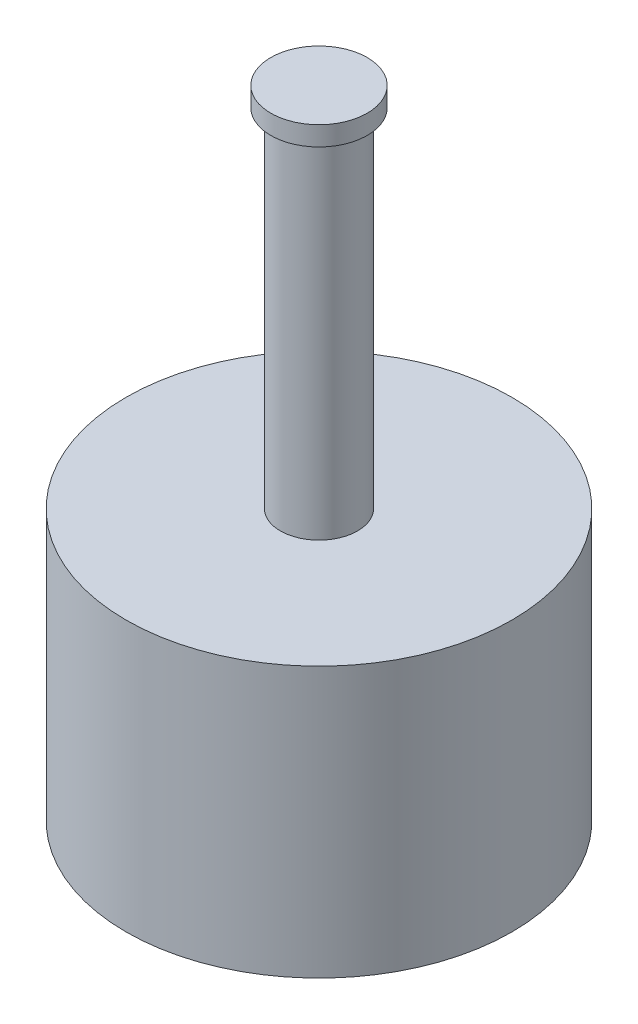
ISO-10303-21;
HEADER;
FILE_DESCRIPTION(('STEP AP214'),'2;1');
FILE_NAME('part.step','',(''),(''),'','','');
FILE_SCHEMA(('AUTOMOTIVE_DESIGN { 1 0 10303 214 1 1 1 1 }'));
ENDSEC;
DATA;
#1=APPLICATION_CONTEXT('core data for automotive mechanical design processes');
#2=APPLICATION_PROTOCOL_DEFINITION('international standard','automotive_design',2000,#1);
#3=PRODUCT_CONTEXT('',#1,'mechanical');
#4=PRODUCT('Part','Part','',(#3));
#5=PRODUCT_RELATED_PRODUCT_CATEGORY('part','',(#4));
#6=PRODUCT_DEFINITION_FORMATION('','',#4);
#7=PRODUCT_DEFINITION_CONTEXT('part definition',#1,'design');
#8=PRODUCT_DEFINITION('design','',#6,#7);
#9=PRODUCT_DEFINITION_SHAPE('','',#8);
#10=(LENGTH_UNIT() NAMED_UNIT(*) SI_UNIT(.MILLI.,.METRE.));
#11=(NAMED_UNIT(*) PLANE_ANGLE_UNIT() SI_UNIT($,.RADIAN.));
#12=(NAMED_UNIT(*) SI_UNIT($,.STERADIAN.) SOLID_ANGLE_UNIT());
#13=UNCERTAINTY_MEASURE_WITH_UNIT(LENGTH_MEASURE(1.E-05),#10,'distance_accuracy_value','');
#14=(GEOMETRIC_REPRESENTATION_CONTEXT(3) GLOBAL_UNCERTAINTY_ASSIGNED_CONTEXT((#13)) GLOBAL_UNIT_ASSIGNED_CONTEXT((#10,
#11,#12)) REPRESENTATION_CONTEXT('',''));
#15=CARTESIAN_POINT('',(0.,0.,0.));
#16=DIRECTION('',(0.,0.,1.));
#17=DIRECTION('',(1.,0.,0.));
#18=AXIS2_PLACEMENT_3D('',#15,#16,#17);
#19=CARTESIAN_POINT('',(0.,12.,0.));
#20=DIRECTION('',(0.,1.,0.));
#21=DIRECTION('',(0.,0.,1.));
#22=AXIS2_PLACEMENT_3D('',#19,#20,#21);
#23=PLANE('',#22);
#24=CARTESIAN_POINT('',(0.,12.,0.));
#25=DIRECTION('',(0.,-1.,0.));
#26=DIRECTION('',(0.,0.,-1.));
#27=AXIS2_PLACEMENT_3D('',#24,#25,#26);
#28=CIRCLE('',#27,2.5);
#29=CARTESIAN_POINT('',(0.,12.,-2.5));
#30=VERTEX_POINT('',#29);
#31=EDGE_CURVE('E10',#30,#30,#28,.T.);
#32=ORIENTED_EDGE('',*,*,#31,.F.);
#33=EDGE_LOOP('',(#32));
#34=FACE_BOUND('',#33,.T.);
#35=ADVANCED_FACE('F43',(#34),#23,.T.);
#36=CARTESIAN_POINT('',(0.,0.,0.));
#37=DIRECTION('',(0.,-1.,0.));
#38=DIRECTION('',(0.,0.,-1.));
#39=AXIS2_PLACEMENT_3D('',#36,#37,#38);
#40=CYLINDRICAL_SURFACE('',#39,2.5);
#41=ORIENTED_EDGE('',*,*,#31,.T.);
#42=EDGE_LOOP('',(#41));
#43=FACE_BOUND('',#42,.T.);
#44=CARTESIAN_POINT('',(0.,11.,0.));
#45=DIRECTION('',(0.,-1.,0.));
#46=DIRECTION('',(0.,0.,-1.));
#47=AXIS2_PLACEMENT_3D('',#44,#45,#46);
#48=CIRCLE('',#47,2.5);
#49=CARTESIAN_POINT('',(0.,11.,-2.5));
#50=VERTEX_POINT('',#49);
#51=EDGE_CURVE('E47',#50,#50,#48,.T.);
#52=ORIENTED_EDGE('',*,*,#51,.F.);
#53=EDGE_LOOP('',(#52));
#54=FACE_BOUND('',#53,.T.);
#55=ADVANCED_FACE('F120',(#43,#54),#40,.T.);
#56=CARTESIAN_POINT('',(2.5,11.,0.));
#57=DIRECTION('',(0.,-1.,0.));
#58=DIRECTION('',(0.,0.,-1.));
#59=AXIS2_PLACEMENT_3D('',#56,#57,#58);
#60=PLANE('',#59);
#61=ORIENTED_EDGE('',*,*,#51,.T.);
#62=EDGE_LOOP('',(#61));
#63=FACE_BOUND('',#62,.T.);
#64=CARTESIAN_POINT('',(0.,11.,0.));
#65=DIRECTION('',(0.,-1.,0.));
#66=DIRECTION('',(0.,0.,-1.));
#67=AXIS2_PLACEMENT_3D('',#64,#65,#66);
#68=CIRCLE('',#67,2.);
#69=CARTESIAN_POINT('',(0.,11.,-2.));
#70=VERTEX_POINT('',#69);
#71=EDGE_CURVE('E52',#70,#70,#68,.T.);
#72=ORIENTED_EDGE('',*,*,#71,.F.);
#73=EDGE_LOOP('',(#72));
#74=FACE_BOUND('',#73,.T.);
#75=ADVANCED_FACE('F124',(#63,#74),#60,.T.);
#76=CARTESIAN_POINT('',(0.,0.,0.));
#77=DIRECTION('',(0.,-1.,0.));
#78=DIRECTION('',(0.,0.,-1.));
#79=AXIS2_PLACEMENT_3D('',#76,#77,#78);
#80=CYLINDRICAL_SURFACE('',#79,2.);
#81=ORIENTED_EDGE('',*,*,#71,.T.);
#82=EDGE_LOOP('',(#81));
#83=FACE_BOUND('',#82,.T.);
#84=CARTESIAN_POINT('',(0.,-7.,0.));
#85=DIRECTION('',(0.,-1.,0.));
#86=DIRECTION('',(0.,0.,-1.));
#87=AXIS2_PLACEMENT_3D('',#84,#85,#86);
#88=CIRCLE('',#87,2.);
#89=CARTESIAN_POINT('',(0.,-7.,-2.));
#90=VERTEX_POINT('',#89);
#91=EDGE_CURVE('E60',#90,#90,#88,.T.);
#92=ORIENTED_EDGE('',*,*,#91,.F.);
#93=EDGE_LOOP('',(#92));
#94=FACE_BOUND('',#93,.T.);
#95=ADVANCED_FACE('F110',(#83,#94),#80,.T.);
#96=CARTESIAN_POINT('',(0.,-21.,0.));
#97=DIRECTION('',(0.,1.,0.));
#98=DIRECTION('',(0.,0.,1.));
#99=AXIS2_PLACEMENT_3D('',#96,#97,#98);
#100=CYLINDRICAL_SURFACE('',#99,10.);
#101=CARTESIAN_POINT('',(0.,-21.,0.));
#102=DIRECTION('',(0.,-1.,0.));
#103=DIRECTION('',(0.,0.,-1.));
#104=AXIS2_PLACEMENT_3D('',#101,#102,#103);
#105=CIRCLE('',#104,10.);
#106=CARTESIAN_POINT('',(0.,-21.,-10.));
#107=VERTEX_POINT('',#106);
#108=EDGE_CURVE('E61',#107,#107,#105,.T.);
#109=ORIENTED_EDGE('',*,*,#108,.F.);
#110=EDGE_LOOP('',(#109));
#111=FACE_BOUND('',#110,.T.);
#112=CARTESIAN_POINT('',(0.,-7.,0.));
#113=DIRECTION('',(0.,-1.,0.));
#114=DIRECTION('',(0.,0.,-1.));
#115=AXIS2_PLACEMENT_3D('',#112,#113,#114);
#116=CIRCLE('',#115,10.);
#117=CARTESIAN_POINT('',(0.,-7.,-10.));
#118=VERTEX_POINT('',#117);
#119=EDGE_CURVE('E65',#118,#118,#116,.T.);
#120=ORIENTED_EDGE('',*,*,#119,.T.);
#121=EDGE_LOOP('',(#120));
#122=FACE_BOUND('',#121,.T.);
#123=ADVANCED_FACE('F99',(#111,#122),#100,.T.);
#124=CARTESIAN_POINT('',(0.,-21.,0.));
#125=DIRECTION('',(0.,-1.,0.));
#126=DIRECTION('',(0.,0.,-1.));
#127=AXIS2_PLACEMENT_3D('',#124,#125,#126);
#128=PLANE('',#127);
#129=CARTESIAN_POINT('',(0.,-21.,0.));
#130=DIRECTION('',(0.,-1.,0.));
#131=DIRECTION('',(0.,0.,-1.));
#132=AXIS2_PLACEMENT_3D('',#129,#130,#131);
#133=CIRCLE('',#132,8.5);
#134=CARTESIAN_POINT('',(0.,-21.,-8.5));
#135=VERTEX_POINT('',#134);
#136=EDGE_CURVE('E68',#135,#135,#133,.T.);
#137=ORIENTED_EDGE('',*,*,#136,.F.);
#138=EDGE_LOOP('',(#137));
#139=FACE_BOUND('',#138,.T.);
#140=ORIENTED_EDGE('',*,*,#108,.T.);
#141=EDGE_LOOP('',(#140));
#142=FACE_BOUND('',#141,.T.);
#143=ADVANCED_FACE('F100',(#139,#142),#128,.T.);
#144=CARTESIAN_POINT('',(0.,-7.,0.));
#145=DIRECTION('',(0.,-1.,0.));
#146=DIRECTION('',(0.,0.,-1.));
#147=AXIS2_PLACEMENT_3D('',#144,#145,#146);
#148=PLANE('',#147);
#149=ORIENTED_EDGE('',*,*,#91,.T.);
#150=EDGE_LOOP('',(#149));
#151=FACE_BOUND('',#150,.T.);
#152=ORIENTED_EDGE('',*,*,#119,.F.);
#153=EDGE_LOOP('',(#152));
#154=FACE_BOUND('',#153,.T.);
#155=ADVANCED_FACE('F91',(#151,#154),#148,.F.);
#156=CARTESIAN_POINT('',(0.,-20.5,0.));
#157=DIRECTION('',(0.,-1.,0.));
#158=DIRECTION('',(0.,0.,-1.));
#159=AXIS2_PLACEMENT_3D('',#156,#157,#158);
#160=CYLINDRICAL_SURFACE('',#159,8.5);
#161=CARTESIAN_POINT('',(0.,-20.5,0.));
#162=DIRECTION('',(0.,-1.,0.));
#163=DIRECTION('',(0.,0.,-1.));
#164=AXIS2_PLACEMENT_3D('',#161,#162,#163);
#165=CIRCLE('',#164,8.5);
#166=CARTESIAN_POINT('',(0.,-20.5,-8.5));
#167=VERTEX_POINT('',#166);
#168=EDGE_CURVE('E66',#167,#167,#165,.T.);
#169=ORIENTED_EDGE('',*,*,#168,.F.);
#170=EDGE_LOOP('',(#169));
#171=FACE_BOUND('',#170,.T.);
#172=ORIENTED_EDGE('',*,*,#136,.T.);
#173=EDGE_LOOP('',(#172));
#174=FACE_BOUND('',#173,.T.);
#175=ADVANCED_FACE('F87',(#171,#174),#160,.F.);
#176=CARTESIAN_POINT('',(0.,-20.5,0.));
#177=DIRECTION('',(0.,-1.,0.));
#178=DIRECTION('',(0.,0.,-1.));
#179=AXIS2_PLACEMENT_3D('',#176,#177,#178);
#180=PLANE('',#179);
#181=CARTESIAN_POINT('',(0.,-20.5,0.));
#182=DIRECTION('',(0.,-1.,0.));
#183=DIRECTION('',(0.,0.,-1.));
#184=AXIS2_PLACEMENT_3D('',#181,#182,#183);
#185=CIRCLE('',#184,4.);
#186=CARTESIAN_POINT('',(0.,-20.5,-4.));
#187=VERTEX_POINT('',#186);
#188=EDGE_CURVE('E75',#187,#187,#185,.T.);
#189=ORIENTED_EDGE('',*,*,#188,.F.);
#190=EDGE_LOOP('',(#189));
#191=FACE_BOUND('',#190,.T.);
#192=ORIENTED_EDGE('',*,*,#168,.T.);
#193=EDGE_LOOP('',(#192));
#194=FACE_BOUND('',#193,.T.);
#195=ADVANCED_FACE('F83',(#191,#194),#180,.T.);
#196=CARTESIAN_POINT('',(0.,-20.5,0.));
#197=DIRECTION('',(0.,-1.,0.));
#198=DIRECTION('',(0.,0.,-1.));
#199=AXIS2_PLACEMENT_3D('',#196,#197,#198);
#200=CYLINDRICAL_SURFACE('',#199,4.);
#201=ORIENTED_EDGE('',*,*,#188,.T.);
#202=EDGE_LOOP('',(#201));
#203=FACE_BOUND('',#202,.T.);
#204=CARTESIAN_POINT('',(0.,-21.,0.));
#205=DIRECTION('',(0.,-1.,0.));
#206=DIRECTION('',(0.,0.,-1.));
#207=AXIS2_PLACEMENT_3D('',#204,#205,#206);
#208=CIRCLE('',#207,4.);
#209=CARTESIAN_POINT('',(0.,-21.,-4.));
#210=VERTEX_POINT('',#209);
#211=EDGE_CURVE('E73',#210,#210,#208,.T.);
#212=ORIENTED_EDGE('',*,*,#211,.F.);
#213=EDGE_LOOP('',(#212));
#214=FACE_BOUND('',#213,.T.);
#215=ADVANCED_FACE('F81',(#203,#214),#200,.T.);
#216=ORIENTED_EDGE('',*,*,#211,.T.);
#217=EDGE_LOOP('',(#216));
#218=FACE_BOUND('',#217,.T.);
#219=ADVANCED_FACE('F105',(#218),#128,.T.);
#220=CLOSED_SHELL('',(#35,#55,#75,#95,#123,#143,#155,#175,#195,#215,#219));
#221=MANIFOLD_SOLID_BREP('B2',#220);
#222=ADVANCED_BREP_SHAPE_REPRESENTATION('',(#18,#221),#14);
#223=SHAPE_DEFINITION_REPRESENTATION(#9,#222);
ENDSEC;
END-ISO-10303-21;
